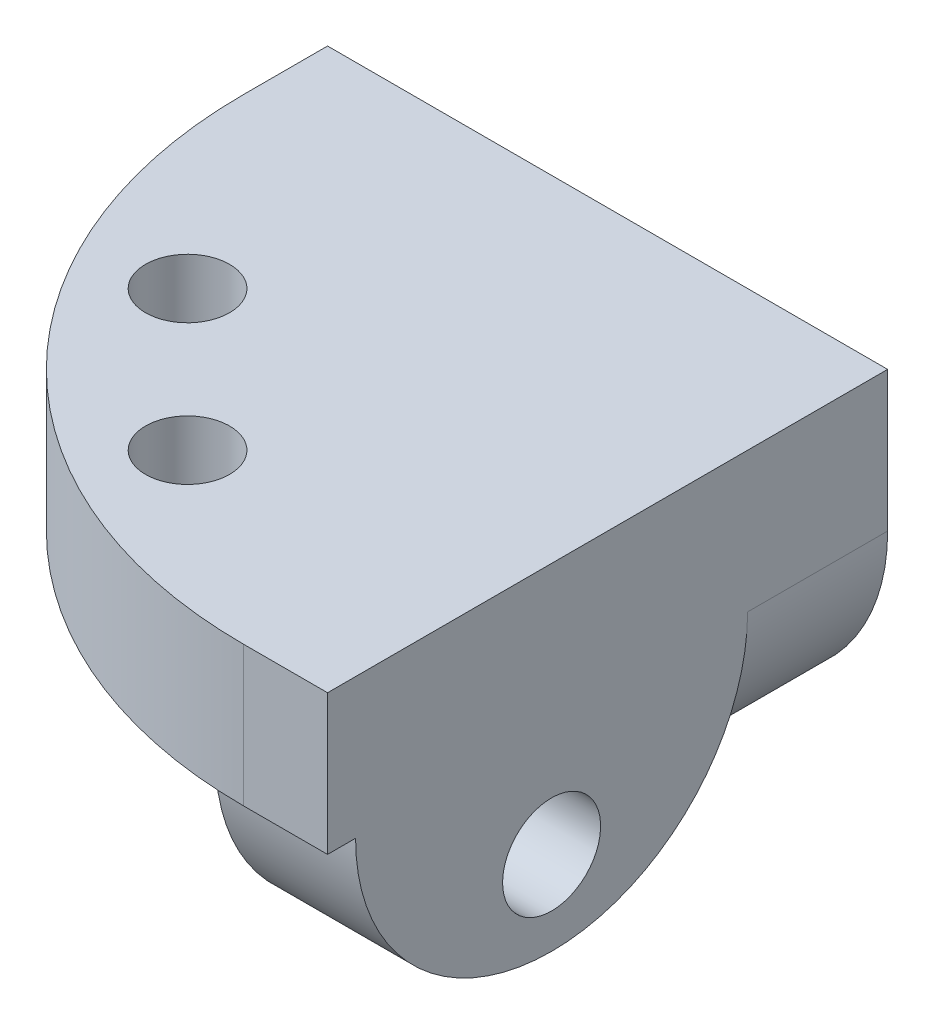
ISO-10303-21;
HEADER;
FILE_DESCRIPTION(('STEP AP214'),'2;1');
FILE_NAME('part.step','',(''),(''),'','','');
FILE_SCHEMA(('AUTOMOTIVE_DESIGN { 1 0 10303 214 1 1 1 1 }'));
ENDSEC;
DATA;
#1=APPLICATION_CONTEXT('core data for automotive mechanical design processes');
#2=APPLICATION_PROTOCOL_DEFINITION('international standard','automotive_design',2000,#1);
#3=PRODUCT_CONTEXT('',#1,'mechanical');
#4=PRODUCT('Part','Part','',(#3));
#5=PRODUCT_RELATED_PRODUCT_CATEGORY('part','',(#4));
#6=PRODUCT_DEFINITION_FORMATION('','',#4);
#7=PRODUCT_DEFINITION_CONTEXT('part definition',#1,'design');
#8=PRODUCT_DEFINITION('design','',#6,#7);
#9=PRODUCT_DEFINITION_SHAPE('','',#8);
#10=(LENGTH_UNIT() NAMED_UNIT(*) SI_UNIT(.MILLI.,.METRE.));
#11=(NAMED_UNIT(*) PLANE_ANGLE_UNIT() SI_UNIT($,.RADIAN.));
#12=(NAMED_UNIT(*) SI_UNIT($,.STERADIAN.) SOLID_ANGLE_UNIT());
#13=UNCERTAINTY_MEASURE_WITH_UNIT(LENGTH_MEASURE(1.E-05),#10,'distance_accuracy_value','');
#14=(GEOMETRIC_REPRESENTATION_CONTEXT(3) GLOBAL_UNCERTAINTY_ASSIGNED_CONTEXT((#13)) GLOBAL_UNIT_ASSIGNED_CONTEXT((#10,
#11,#12)) REPRESENTATION_CONTEXT('',''));
#15=CARTESIAN_POINT('',(0.,0.,0.));
#16=DIRECTION('',(0.,0.,1.));
#17=DIRECTION('',(1.,0.,0.));
#18=AXIS2_PLACEMENT_3D('',#15,#16,#17);
#19=CARTESIAN_POINT('',(36.9038345943524,5.00000446748986,-36.9038345943523));
#20=DIRECTION('',(1.21057605777873E-07,-0.999999999999985,-1.21057605777873E-07));
#21=DIRECTION('',(-0.999999999999993,-1.21057605777873E-07,0.));
#22=AXIS2_PLACEMENT_3D('',#19,#20,#21);
#23=PLANE('',#22);
#24=DIRECTION('',(-0.999999999999993,-1.21057605777873E-07,0.));
#25=VECTOR('',#24,1.);
#26=CARTESIAN_POINT('',(36.9038345943525,5.00000204633775,-16.9038345943524));
#27=LINE('',#26,#25);
#28=CARTESIAN_POINT('',(36.9038345943525,5.00000204633775,-16.9038345943524));
#29=VERTEX_POINT('',#28);
#30=CARTESIAN_POINT('',(33.9038345943525,5.00000168316493,-16.9038345943524));
#31=VERTEX_POINT('',#30);
#32=EDGE_CURVE('E162',#29,#31,#27,.T.);
#33=ORIENTED_EDGE('',*,*,#32,.F.);
#34=DIRECTION('',(0.,-1.21057605777873E-07,0.999999999999993));
#35=VECTOR('',#34,1.);
#36=CARTESIAN_POINT('',(36.9038345943524,5.00000446748986,-36.9038345943523));
#37=LINE('',#36,#35);
#38=CARTESIAN_POINT('',(36.9038345943524,5.00000446748986,-36.9038345943523));
#39=VERTEX_POINT('',#38);
#40=EDGE_CURVE('E164',#39,#29,#37,.T.);
#41=ORIENTED_EDGE('',*,*,#40,.F.);
#42=DIRECTION('',(0.999999999999993,1.21057605777873E-07,0.));
#43=VECTOR('',#42,1.);
#44=CARTESIAN_POINT('',(36.9038345943524,5.00000446748986,-36.9038345943523));
#45=LINE('',#44,#43);
#46=CARTESIAN_POINT('',(16.9038345943525,5.00000204633775,-36.9038345943525));
#47=VERTEX_POINT('',#46);
#48=EDGE_CURVE('E143',#47,#39,#45,.T.);
#49=ORIENTED_EDGE('',*,*,#48,.F.);
#50=DIRECTION('',(0.,1.21057605777873E-07,-0.999999999999993));
#51=VECTOR('',#50,1.);
#52=CARTESIAN_POINT('',(16.9038345943525,5.00000204633775,-36.9038345943525));
#53=LINE('',#52,#51);
#54=CARTESIAN_POINT('',(16.9038345943526,5.00000168316493,-33.9038345943525));
#55=VERTEX_POINT('',#54);
#56=EDGE_CURVE('E147',#55,#47,#53,.T.);
#57=ORIENTED_EDGE('',*,*,#56,.F.);
#58=CARTESIAN_POINT('',(33.9038345943524,5.00000374114423,-33.9038345943523));
#59=DIRECTION('',(-1.21057605777873E-07,0.999999999999985,1.21057605777873E-07));
#60=DIRECTION('',(-0.999999999999993,-1.21057605777873E-07,0.));
#61=AXIS2_PLACEMENT_3D('',#58,#59,#60);
#62=CIRCLE('',#61,17.);
#63=EDGE_CURVE('E11',#31,#55,#62,.F.);
#64=ORIENTED_EDGE('',*,*,#63,.F.);
#65=EDGE_LOOP('',(#33,#41,#49,#57,#64));
#66=FACE_BOUND('',#65,.T.);
#67=CARTESIAN_POINT('',(21.9038345943525,5.00000144104972,-26.9038345943525));
#68=DIRECTION('',(1.21057605777873E-07,-0.999999999999985,-1.21057605777873E-07));
#69=DIRECTION('',(0.999999999999993,1.21057605777873E-07,0.));
#70=AXIS2_PLACEMENT_3D('',#67,#68,#69);
#71=CIRCLE('',#70,1.5);
#72=CARTESIAN_POINT('',(23.4038345943525,5.00000162263612,-26.9038345943525));
#73=VERTEX_POINT('',#72);
#74=EDGE_CURVE('E178',#73,#73,#71,.T.);
#75=ORIENTED_EDGE('',*,*,#74,.T.);
#76=EDGE_LOOP('',(#75));
#77=FACE_BOUND('',#76,.T.);
#78=CARTESIAN_POINT('',(26.9038345943525,5.00000144104972,-21.9038345943525));
#79=DIRECTION('',(1.21057605777873E-07,-0.999999999999985,-1.21057605777873E-07));
#80=DIRECTION('',(0.999999999999993,1.21057605777873E-07,0.));
#81=AXIS2_PLACEMENT_3D('',#78,#79,#80);
#82=CIRCLE('',#81,1.5);
#83=CARTESIAN_POINT('',(28.4038345943525,5.00000162263612,-21.9038345943525));
#84=VERTEX_POINT('',#83);
#85=EDGE_CURVE('E179',#84,#84,#82,.T.);
#86=ORIENTED_EDGE('',*,*,#85,.T.);
#87=EDGE_LOOP('',(#86));
#88=FACE_BOUND('',#87,.T.);
#89=ADVANCED_FACE('F34',(#66,#77,#88),#23,.F.);
#90=CARTESIAN_POINT('',(36.9038351996404,4.46748993328969E-06,-36.9038351996403));
#91=DIRECTION('',(1.21057605777873E-07,-0.999999999999985,-1.21057605777873E-07));
#92=DIRECTION('',(-0.999999999999993,-1.21057605777873E-07,0.));
#93=AXIS2_PLACEMENT_3D('',#90,#91,#92);
#94=PLANE('',#93);
#95=DIRECTION('',(0.,1.21057605777873E-07,-0.999999999999993));
#96=VECTOR('',#95,1.);
#97=CARTESIAN_POINT('',(16.9038351996406,2.04633781773223E-06,-36.9038351996405));
#98=LINE('',#97,#96);
#99=CARTESIAN_POINT('',(16.9038351996406,1.68316500039861E-06,-33.9038351996405));
#100=VERTEX_POINT('',#99);
#101=CARTESIAN_POINT('',(16.9038351996406,2.04633781773223E-06,-36.9038351996405));
#102=VERTEX_POINT('',#101);
#103=EDGE_CURVE('E135',#100,#102,#98,.T.);
#104=ORIENTED_EDGE('',*,*,#103,.T.);
#105=DIRECTION('',(0.999999999999993,1.21057605777873E-07,0.));
#106=VECTOR('',#105,1.);
#107=CARTESIAN_POINT('',(36.9038351996404,4.46748993328969E-06,-36.9038351996403));
#108=LINE('',#107,#106);
#109=CARTESIAN_POINT('',(22.9038351996405,2.77268345239947E-06,-36.9038351996404));
#110=VERTEX_POINT('',#109);
#111=EDGE_CURVE('E137',#102,#110,#108,.T.);
#112=ORIENTED_EDGE('',*,*,#111,.T.);
#113=DIRECTION('',(0.,1.21057605777873E-07,-0.999999999999993));
#114=VECTOR('',#113,1.);
#115=CARTESIAN_POINT('',(22.9038351996405,2.1673954235101E-06,-31.9038351996405));
#116=LINE('',#115,#114);
#117=CARTESIAN_POINT('',(22.9038351996405,2.1673954235101E-06,-31.9038351996405));
#118=VERTEX_POINT('',#117);
#119=EDGE_CURVE('E193',#118,#110,#116,.T.);
#120=ORIENTED_EDGE('',*,*,#119,.F.);
#121=DIRECTION('',(-0.999999999999993,-1.21057605777873E-07,0.));
#122=VECTOR('',#121,1.);
#123=CARTESIAN_POINT('',(36.9038351996404,3.86220190440032E-06,-31.9038351996403));
#124=LINE('',#123,#122);
#125=CARTESIAN_POINT('',(31.9038351996405,3.25691387551096E-06,-31.9038351996404));
#126=VERTEX_POINT('',#125);
#127=EDGE_CURVE('E102',#126,#118,#124,.T.);
#128=ORIENTED_EDGE('',*,*,#127,.F.);
#129=DIRECTION('',(0.,1.21057605777873E-07,-0.999999999999993));
#130=VECTOR('',#129,1.);
#131=CARTESIAN_POINT('',(31.9038351996405,1.56210739462073E-06,-17.9038351996405));
#132=LINE('',#131,#130);
#133=CARTESIAN_POINT('',(31.9038351996405,1.56210739462073E-06,-17.9038351996405));
#134=VERTEX_POINT('',#133);
#135=EDGE_CURVE('E186',#134,#126,#132,.T.);
#136=ORIENTED_EDGE('',*,*,#135,.F.);
#137=DIRECTION('',(0.999999999999993,1.21057605777873E-07,0.));
#138=VECTOR('',#137,1.);
#139=CARTESIAN_POINT('',(31.9038351996405,1.56210739462073E-06,-17.9038351996405));
#140=LINE('',#139,#138);
#141=CARTESIAN_POINT('',(36.9038351996405,2.1673954235101E-06,-17.9038351996404));
#142=VERTEX_POINT('',#141);
#143=EDGE_CURVE('E118',#134,#142,#140,.T.);
#144=ORIENTED_EDGE('',*,*,#143,.T.);
#145=DIRECTION('',(0.,-1.21057605777873E-07,0.999999999999993));
#146=VECTOR('',#145,1.);
#147=CARTESIAN_POINT('',(36.9038351996404,4.46748993328969E-06,-36.9038351996403));
#148=LINE('',#147,#146);
#149=CARTESIAN_POINT('',(36.9038351996405,2.04633781773222E-06,-16.9038351996404));
#150=VERTEX_POINT('',#149);
#151=EDGE_CURVE('E126',#142,#150,#148,.T.);
#152=ORIENTED_EDGE('',*,*,#151,.T.);
#153=DIRECTION('',(-0.999999999999993,-1.21057605777873E-07,0.));
#154=VECTOR('',#153,1.);
#155=CARTESIAN_POINT('',(36.9038351996405,2.04633781773222E-06,-16.9038351996404));
#156=LINE('',#155,#154);
#157=CARTESIAN_POINT('',(33.9038351996405,1.68316500039861E-06,-16.9038351996405));
#158=VERTEX_POINT('',#157);
#159=EDGE_CURVE('E132',#150,#158,#156,.T.);
#160=ORIENTED_EDGE('',*,*,#159,.T.);
#161=CARTESIAN_POINT('',(33.9038351996405,3.74114429862245E-06,-33.9038351996403));
#162=DIRECTION('',(-1.21057605777873E-07,0.999999999999985,1.21057605777873E-07));
#163=DIRECTION('',(-0.999999999999993,-1.21057605777873E-07,0.));
#164=AXIS2_PLACEMENT_3D('',#161,#162,#163);
#165=CIRCLE('',#164,17.);
#166=EDGE_CURVE('E153',#100,#158,#165,.T.);
#167=ORIENTED_EDGE('',*,*,#166,.F.);
#168=EDGE_LOOP('',(#104,#112,#120,#128,#136,#144,#152,#160,#167));
#169=FACE_BOUND('',#168,.T.);
#170=CARTESIAN_POINT('',(21.9038351996406,1.44104978884286E-06,-26.9038351996405));
#171=DIRECTION('',(1.21057605777873E-07,-0.999999999999985,-1.21057605777873E-07));
#172=DIRECTION('',(0.999999999999993,1.21057605777873E-07,0.));
#173=AXIS2_PLACEMENT_3D('',#170,#171,#172);
#174=CIRCLE('',#173,1.5);
#175=CARTESIAN_POINT('',(23.4038351996406,1.62263619750967E-06,-26.9038351996405));
#176=VERTEX_POINT('',#175);
#177=EDGE_CURVE('E175',#176,#176,#174,.T.);
#178=ORIENTED_EDGE('',*,*,#177,.F.);
#179=EDGE_LOOP('',(#178));
#180=FACE_BOUND('',#179,.T.);
#181=CARTESIAN_POINT('',(26.9038351996405,1.44104978884286E-06,-21.9038351996405));
#182=DIRECTION('',(1.21057605777873E-07,-0.999999999999985,-1.21057605777873E-07));
#183=DIRECTION('',(0.999999999999993,1.21057605777873E-07,0.));
#184=AXIS2_PLACEMENT_3D('',#181,#182,#183);
#185=CIRCLE('',#184,1.5);
#186=CARTESIAN_POINT('',(28.4038351996405,1.62263619750967E-06,-21.9038351996405));
#187=VERTEX_POINT('',#186);
#188=EDGE_CURVE('E117',#187,#187,#185,.T.);
#189=ORIENTED_EDGE('',*,*,#188,.F.);
#190=EDGE_LOOP('',(#189));
#191=FACE_BOUND('',#190,.T.);
#192=ADVANCED_FACE('F157',(#169,#180,#191),#94,.T.);
#193=CARTESIAN_POINT('',(36.9038345943524,5.00000446748986,-36.9038345943523));
#194=DIRECTION('',(0.,-1.21057605777873E-07,0.999999999999993));
#195=DIRECTION('',(-0.999999999999993,-1.21057605777873E-07,0.));
#196=AXIS2_PLACEMENT_3D('',#193,#194,#195);
#197=PLANE('',#196);
#198=ORIENTED_EDGE('',*,*,#111,.F.);
#199=DIRECTION('',(1.21057605777873E-07,-0.999999999999985,-1.21057605777873E-07));
#200=VECTOR('',#199,1.);
#201=CARTESIAN_POINT('',(16.9038345943525,5.00000204633775,-36.9038345943525));
#202=LINE('',#201,#200);
#203=EDGE_CURVE('E144',#47,#102,#202,.T.);
#204=ORIENTED_EDGE('',*,*,#203,.F.);
#205=ORIENTED_EDGE('',*,*,#48,.T.);
#206=DIRECTION('',(1.21057605777873E-07,-0.999999999999985,-1.21057605777873E-07));
#207=VECTOR('',#206,1.);
#208=CARTESIAN_POINT('',(36.9038345943524,5.00000446748986,-36.9038345943523));
#209=LINE('',#208,#207);
#210=CARTESIAN_POINT('',(36.9038351996404,4.46748993328969E-06,-36.9038351996403));
#211=VERTEX_POINT('',#210);
#212=EDGE_CURVE('E149',#39,#211,#209,.T.);
#213=ORIENTED_EDGE('',*,*,#212,.T.);
#214=CARTESIAN_POINT('',(29.9038351996405,3.62008669284458E-06,-36.9038351996404));
#215=DIRECTION('',(0.,-1.21057605777873E-07,0.999999999999993));
#216=DIRECTION('',(-0.999999999999993,-1.21057605777873E-07,0.));
#217=AXIS2_PLACEMENT_3D('',#214,#215,#216);
#218=CIRCLE('',#217,7.);
#219=EDGE_CURVE('E107',#110,#211,#218,.T.);
#220=ORIENTED_EDGE('',*,*,#219,.F.);
#221=EDGE_LOOP('',(#198,#204,#205,#213,#220));
#222=FACE_BOUND('',#221,.T.);
#223=CARTESIAN_POINT('',(29.9038356838709,-3.99999637991325,-36.9038356838708));
#224=DIRECTION('',(0.,-1.21057605777873E-07,0.999999999999993));
#225=DIRECTION('',(0.999999999999993,1.21057605777873E-07,0.));
#226=AXIS2_PLACEMENT_3D('',#223,#224,#225);
#227=CIRCLE('',#226,1.75);
#228=CARTESIAN_POINT('',(31.6538356838709,-3.99999616806244,-36.9038356838708));
#229=VERTEX_POINT('',#228);
#230=EDGE_CURVE('E200',#229,#229,#227,.T.);
#231=ORIENTED_EDGE('',*,*,#230,.T.);
#232=EDGE_LOOP('',(#231));
#233=FACE_BOUND('',#232,.T.);
#234=ADVANCED_FACE('F223',(#222,#233),#197,.F.);
#235=CARTESIAN_POINT('',(36.9038345943524,5.00000446748986,-36.9038345943523));
#236=DIRECTION('',(-0.999999999999993,-1.21057605777873E-07,0.));
#237=DIRECTION('',(0.,1.21057605777873E-07,-0.999999999999993));
#238=AXIS2_PLACEMENT_3D('',#235,#236,#237);
#239=PLANE('',#238);
#240=CARTESIAN_POINT('',(36.9038351996404,3.86220190440032E-06,-31.9038351996403));
#241=VERTEX_POINT('',#240);
#242=EDGE_CURVE('E123',#211,#241,#148,.T.);
#243=ORIENTED_EDGE('',*,*,#242,.F.);
#244=ORIENTED_EDGE('',*,*,#212,.F.);
#245=ORIENTED_EDGE('',*,*,#40,.T.);
#246=DIRECTION('',(1.21057605777873E-07,-0.999999999999985,-1.21057605777873E-07));
#247=VECTOR('',#246,1.);
#248=CARTESIAN_POINT('',(36.9038345943525,5.00000204633775,-16.9038345943524));
#249=LINE('',#248,#247);
#250=EDGE_CURVE('E146',#29,#150,#249,.T.);
#251=ORIENTED_EDGE('',*,*,#250,.T.);
#252=ORIENTED_EDGE('',*,*,#151,.F.);
#253=CARTESIAN_POINT('',(36.9038351996405,3.01479866395521E-06,-24.9038351996404));
#254=DIRECTION('',(-0.999999999999993,-1.21057605777873E-07,0.));
#255=DIRECTION('',(0.,-1.21057605777873E-07,0.999999999999993));
#256=AXIS2_PLACEMENT_3D('',#253,#254,#255);
#257=CIRCLE('',#256,7.);
#258=EDGE_CURVE('E113',#241,#142,#257,.T.);
#259=ORIENTED_EDGE('',*,*,#258,.F.);
#260=EDGE_LOOP('',(#243,#244,#245,#251,#252,#259));
#261=FACE_BOUND('',#260,.T.);
#262=CARTESIAN_POINT('',(36.9038356838709,-3.99999698520128,-24.9038356838708));
#263=DIRECTION('',(-0.999999999999993,-1.21057605777873E-07,0.));
#264=DIRECTION('',(0.,-1.21057605777873E-07,0.999999999999993));
#265=AXIS2_PLACEMENT_3D('',#262,#263,#264);
#266=CIRCLE('',#265,1.75);
#267=CARTESIAN_POINT('',(36.9038356838709,-3.99999719705209,-23.1538356838708));
#268=VERTEX_POINT('',#267);
#269=EDGE_CURVE('E190',#268,#268,#266,.T.);
#270=ORIENTED_EDGE('',*,*,#269,.T.);
#271=EDGE_LOOP('',(#270));
#272=FACE_BOUND('',#271,.T.);
#273=ADVANCED_FACE('F121',(#261,#272),#239,.F.);
#274=CARTESIAN_POINT('',(36.9038345943525,5.00000204633775,-16.9038345943524));
#275=DIRECTION('',(0.,1.21057605777873E-07,-0.999999999999993));
#276=DIRECTION('',(0.999999999999993,1.21057605777873E-07,0.));
#277=AXIS2_PLACEMENT_3D('',#274,#275,#276);
#278=PLANE('',#277);
#279=ORIENTED_EDGE('',*,*,#159,.F.);
#280=ORIENTED_EDGE('',*,*,#250,.F.);
#281=ORIENTED_EDGE('',*,*,#32,.T.);
#282=DIRECTION('',(1.21057605777873E-07,-0.999999999999985,-1.21057605777873E-07));
#283=VECTOR('',#282,1.);
#284=CARTESIAN_POINT('',(33.9038345943525,5.00000168316493,-16.9038345943524));
#285=LINE('',#284,#283);
#286=EDGE_CURVE('E42',#158,#31,#285,.F.);
#287=ORIENTED_EDGE('',*,*,#286,.F.);
#288=EDGE_LOOP('',(#279,#280,#281,#287));
#289=FACE_BOUND('',#288,.T.);
#290=ADVANCED_FACE('F159',(#289),#278,.F.);
#291=CARTESIAN_POINT('',(16.9038345943525,5.00000204633775,-36.9038345943525));
#292=DIRECTION('',(0.999999999999993,1.21057605777873E-07,0.));
#293=DIRECTION('',(0.,-1.21057605777873E-07,0.999999999999993));
#294=AXIS2_PLACEMENT_3D('',#291,#292,#293);
#295=PLANE('',#294);
#296=ORIENTED_EDGE('',*,*,#56,.T.);
#297=ORIENTED_EDGE('',*,*,#203,.T.);
#298=ORIENTED_EDGE('',*,*,#103,.F.);
#299=DIRECTION('',(1.21057605777873E-07,-0.999999999999985,-1.21057605777873E-07));
#300=VECTOR('',#299,1.);
#301=CARTESIAN_POINT('',(16.9038345943526,5.00000168316493,-33.9038345943525));
#302=LINE('',#301,#300);
#303=EDGE_CURVE('E151',#55,#100,#302,.T.);
#304=ORIENTED_EDGE('',*,*,#303,.F.);
#305=EDGE_LOOP('',(#296,#297,#298,#304));
#306=FACE_BOUND('',#305,.T.);
#307=ADVANCED_FACE('F229',(#306),#295,.F.);
#308=CARTESIAN_POINT('',(21.9038345943525,5.00000144104972,-26.9038345943525));
#309=DIRECTION('',(1.21057605777873E-07,-0.999999999999985,-1.21057605777873E-07));
#310=DIRECTION('',(-0.999999999999993,-1.21057605777873E-07,0.));
#311=AXIS2_PLACEMENT_3D('',#308,#309,#310);
#312=CYLINDRICAL_SURFACE('',#311,1.5);
#313=ORIENTED_EDGE('',*,*,#74,.F.);
#314=EDGE_LOOP('',(#313));
#315=FACE_BOUND('',#314,.T.);
#316=ORIENTED_EDGE('',*,*,#177,.T.);
#317=EDGE_LOOP('',(#316));
#318=FACE_BOUND('',#317,.T.);
#319=ADVANCED_FACE('F226',(#315,#318),#312,.F.);
#320=CARTESIAN_POINT('',(26.9038345943525,5.00000144104972,-21.9038345943525));
#321=DIRECTION('',(1.21057605777873E-07,-0.999999999999985,-1.21057605777873E-07));
#322=DIRECTION('',(-0.999999999999993,-1.21057605777873E-07,0.));
#323=AXIS2_PLACEMENT_3D('',#320,#321,#322);
#324=CYLINDRICAL_SURFACE('',#323,1.5);
#325=ORIENTED_EDGE('',*,*,#85,.F.);
#326=EDGE_LOOP('',(#325));
#327=FACE_BOUND('',#326,.T.);
#328=ORIENTED_EDGE('',*,*,#188,.T.);
#329=EDGE_LOOP('',(#328));
#330=FACE_BOUND('',#329,.T.);
#331=ADVANCED_FACE('F256',(#327,#330),#324,.F.);
#332=CARTESIAN_POINT('',(31.9038351996405,2.40951063506585E-06,-24.9038351996404));
#333=DIRECTION('',(0.999999999999993,1.21057605777873E-07,0.));
#334=DIRECTION('',(0.,-1.21057605777873E-07,0.999999999999993));
#335=AXIS2_PLACEMENT_3D('',#332,#333,#334);
#336=CYLINDRICAL_SURFACE('',#335,7.);
#337=ORIENTED_EDGE('',*,*,#258,.T.);
#338=ORIENTED_EDGE('',*,*,#143,.F.);
#339=CARTESIAN_POINT('',(31.9038351996405,2.40951063506585E-06,-24.9038351996404));
#340=DIRECTION('',(-0.999999999999993,-1.21057605777873E-07,0.));
#341=DIRECTION('',(0.,-1.21057605777873E-07,0.999999999999993));
#342=AXIS2_PLACEMENT_3D('',#339,#340,#341);
#343=CIRCLE('',#342,7.);
#344=EDGE_CURVE('E115',#126,#134,#343,.T.);
#345=ORIENTED_EDGE('',*,*,#344,.F.);
#346=DIRECTION('',(0.999999999999993,1.21057605777873E-07,0.));
#347=VECTOR('',#346,1.);
#348=CARTESIAN_POINT('',(31.9038351996405,3.25691387551096E-06,-31.9038351996404));
#349=LINE('',#348,#347);
#350=EDGE_CURVE('E99',#126,#241,#349,.T.);
#351=ORIENTED_EDGE('',*,*,#350,.T.);
#352=EDGE_LOOP('',(#337,#338,#345,#351));
#353=FACE_BOUND('',#352,.T.);
#354=ADVANCED_FACE('F111',(#353),#336,.T.);
#355=CARTESIAN_POINT('',(31.9038351996405,2.40951063506585E-06,-24.9038351996404));
#356=DIRECTION('',(0.999999999999993,1.21057605777873E-07,0.));
#357=DIRECTION('',(0.,-1.21057605777873E-07,0.999999999999993));
#358=AXIS2_PLACEMENT_3D('',#355,#356,#357);
#359=PLANE('',#358);
#360=CARTESIAN_POINT('',(31.9038356838709,-3.99999759048931,-24.9038356838709));
#361=DIRECTION('',(-0.999999999999993,-1.21057605777873E-07,0.));
#362=DIRECTION('',(0.,-1.21057605777873E-07,0.999999999999993));
#363=AXIS2_PLACEMENT_3D('',#360,#361,#362);
#364=CIRCLE('',#363,1.75);
#365=CARTESIAN_POINT('',(31.9038356838709,-3.99999780234012,-23.1538356838709));
#366=VERTEX_POINT('',#365);
#367=EDGE_CURVE('E128',#366,#366,#364,.T.);
#368=ORIENTED_EDGE('',*,*,#367,.F.);
#369=EDGE_LOOP('',(#368));
#370=FACE_BOUND('',#369,.T.);
#371=ORIENTED_EDGE('',*,*,#344,.T.);
#372=ORIENTED_EDGE('',*,*,#135,.T.);
#373=EDGE_LOOP('',(#371,#372));
#374=FACE_BOUND('',#373,.T.);
#375=ADVANCED_FACE('F246',(#370,#374),#359,.F.);
#376=CARTESIAN_POINT('',(31.9038356838709,-3.99999759048931,-24.9038356838709));
#377=DIRECTION('',(0.999999999999993,1.21057605777873E-07,0.));
#378=DIRECTION('',(0.,-1.21057605777873E-07,0.999999999999993));
#379=AXIS2_PLACEMENT_3D('',#376,#377,#378);
#380=CYLINDRICAL_SURFACE('',#379,1.75);
#381=ORIENTED_EDGE('',*,*,#367,.T.);
#382=EDGE_LOOP('',(#381));
#383=FACE_BOUND('',#382,.T.);
#384=ORIENTED_EDGE('',*,*,#269,.F.);
#385=EDGE_LOOP('',(#384));
#386=FACE_BOUND('',#385,.T.);
#387=ADVANCED_FACE('F216',(#383,#386),#380,.F.);
#388=CARTESIAN_POINT('',(29.9038351996405,3.01479866395521E-06,-31.9038351996404));
#389=DIRECTION('',(0.,1.21057605777873E-07,-0.999999999999993));
#390=DIRECTION('',(0.999999999999993,1.21057605777873E-07,0.));
#391=AXIS2_PLACEMENT_3D('',#388,#389,#390);
#392=CYLINDRICAL_SURFACE('',#391,7.);
#393=ORIENTED_EDGE('',*,*,#219,.T.);
#394=ORIENTED_EDGE('',*,*,#242,.T.);
#395=CARTESIAN_POINT('',(29.9038351996405,3.01479866395521E-06,-31.9038351996404));
#396=DIRECTION('',(0.,-1.21057605777873E-07,0.999999999999993));
#397=DIRECTION('',(-0.999999999999993,-1.21057605777873E-07,0.));
#398=AXIS2_PLACEMENT_3D('',#395,#396,#397);
#399=CIRCLE('',#398,7.);
#400=EDGE_CURVE('E96',#118,#241,#399,.T.);
#401=ORIENTED_EDGE('',*,*,#400,.F.);
#402=ORIENTED_EDGE('',*,*,#119,.T.);
#403=EDGE_LOOP('',(#393,#394,#401,#402));
#404=FACE_BOUND('',#403,.T.);
#405=ADVANCED_FACE('F130',(#404),#392,.T.);
#406=CARTESIAN_POINT('',(29.9038351996405,3.01479866395521E-06,-31.9038351996404));
#407=DIRECTION('',(0.,-1.21057605777873E-07,0.999999999999993));
#408=DIRECTION('',(-0.999999999999993,-1.21057605777873E-07,0.));
#409=AXIS2_PLACEMENT_3D('',#406,#407,#408);
#410=PLANE('',#409);
#411=CARTESIAN_POINT('',(29.9038356838709,-3.99999698520128,-31.9038356838708));
#412=DIRECTION('',(0.,-1.21057605777873E-07,0.999999999999993));
#413=DIRECTION('',(0.999999999999993,1.21057605777873E-07,0.));
#414=AXIS2_PLACEMENT_3D('',#411,#412,#413);
#415=CIRCLE('',#414,1.75);
#416=CARTESIAN_POINT('',(31.6538356838709,-3.99999677335047,-31.9038356838708));
#417=VERTEX_POINT('',#416);
#418=EDGE_CURVE('E198',#417,#417,#415,.T.);
#419=ORIENTED_EDGE('',*,*,#418,.F.);
#420=EDGE_LOOP('',(#419));
#421=FACE_BOUND('',#420,.T.);
#422=ORIENTED_EDGE('',*,*,#400,.T.);
#423=ORIENTED_EDGE('',*,*,#350,.F.);
#424=ORIENTED_EDGE('',*,*,#127,.T.);
#425=EDGE_LOOP('',(#422,#423,#424));
#426=FACE_BOUND('',#425,.T.);
#427=ADVANCED_FACE('F98',(#421,#426),#410,.T.);
#428=CARTESIAN_POINT('',(29.9038356838709,-3.99999698520128,-31.9038356838708));
#429=DIRECTION('',(0.,1.21057605777873E-07,-0.999999999999993));
#430=DIRECTION('',(0.999999999999993,1.21057605777873E-07,0.));
#431=AXIS2_PLACEMENT_3D('',#428,#429,#430);
#432=CYLINDRICAL_SURFACE('',#431,1.75);
#433=ORIENTED_EDGE('',*,*,#418,.T.);
#434=EDGE_LOOP('',(#433));
#435=FACE_BOUND('',#434,.T.);
#436=ORIENTED_EDGE('',*,*,#230,.F.);
#437=EDGE_LOOP('',(#436));
#438=FACE_BOUND('',#437,.T.);
#439=ADVANCED_FACE('F206',(#435,#438),#432,.F.);
#440=CARTESIAN_POINT('',(33.9038345943524,5.00000374114423,-33.9038345943523));
#441=DIRECTION('',(1.21057605777873E-07,-0.999999999999985,-1.21057605777873E-07));
#442=DIRECTION('',(-0.999999999999993,-1.21057605777873E-07,0.));
#443=AXIS2_PLACEMENT_3D('',#440,#441,#442);
#444=CYLINDRICAL_SURFACE('',#443,17.);
#445=ORIENTED_EDGE('',*,*,#63,.T.);
#446=ORIENTED_EDGE('',*,*,#303,.T.);
#447=ORIENTED_EDGE('',*,*,#166,.T.);
#448=ORIENTED_EDGE('',*,*,#286,.T.);
#449=EDGE_LOOP('',(#445,#446,#447,#448));
#450=FACE_BOUND('',#449,.T.);
#451=ADVANCED_FACE('F36',(#450),#444,.T.);
#452=CLOSED_SHELL('',(#89,#192,#234,#273,#290,#307,#319,#331,#354,#375,#387,#405,#427,#439,#451));
#453=MANIFOLD_SOLID_BREP('B2',#452);
#454=ADVANCED_BREP_SHAPE_REPRESENTATION('',(#18,#453),#14);
#455=SHAPE_DEFINITION_REPRESENTATION(#9,#454);
ENDSEC;
END-ISO-10303-21;
